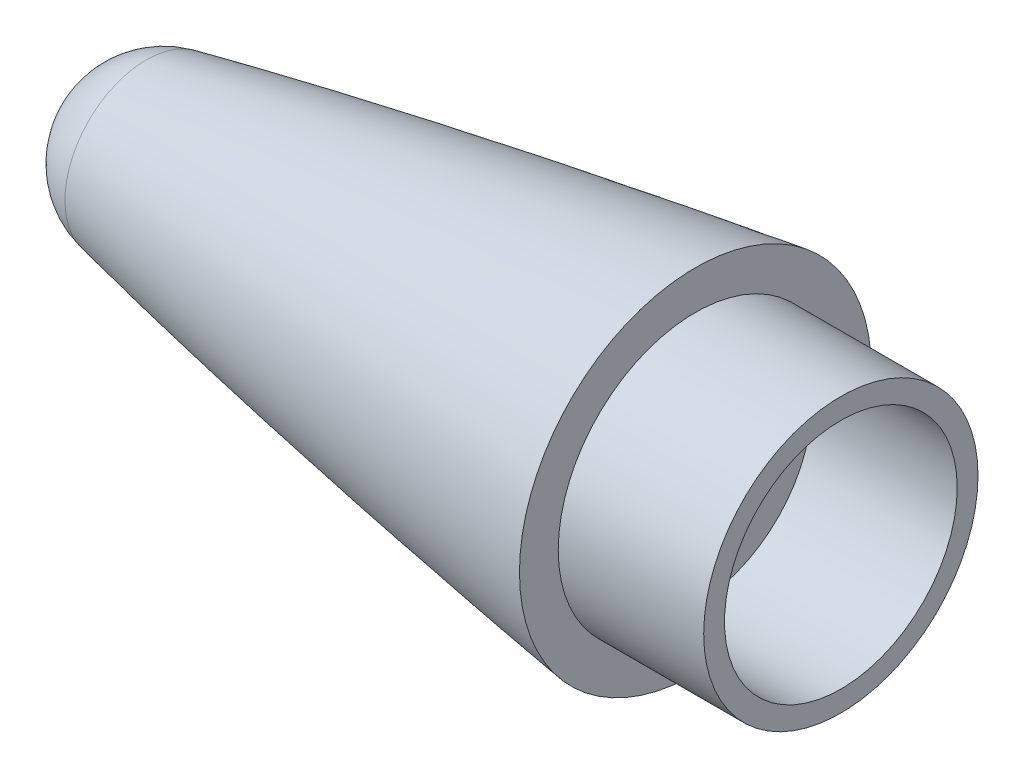
ISO-10303-21;
HEADER;
FILE_DESCRIPTION(('STEP AP214'),'2;1');
FILE_NAME('part.step','',(''),(''),'','','');
FILE_SCHEMA(('AUTOMOTIVE_DESIGN { 1 0 10303 214 1 1 1 1 }'));
ENDSEC;
DATA;
#1=APPLICATION_CONTEXT('core data for automotive mechanical design processes');
#2=APPLICATION_PROTOCOL_DEFINITION('international standard','automotive_design',2000,#1);
#3=PRODUCT_CONTEXT('',#1,'mechanical');
#4=PRODUCT('Part','Part','',(#3));
#5=PRODUCT_RELATED_PRODUCT_CATEGORY('part','',(#4));
#6=PRODUCT_DEFINITION_FORMATION('','',#4);
#7=PRODUCT_DEFINITION_CONTEXT('part definition',#1,'design');
#8=PRODUCT_DEFINITION('design','',#6,#7);
#9=PRODUCT_DEFINITION_SHAPE('','',#8);
#10=(LENGTH_UNIT() NAMED_UNIT(*) SI_UNIT(.MILLI.,.METRE.));
#11=(NAMED_UNIT(*) PLANE_ANGLE_UNIT() SI_UNIT($,.RADIAN.));
#12=(NAMED_UNIT(*) SI_UNIT($,.STERADIAN.) SOLID_ANGLE_UNIT());
#13=UNCERTAINTY_MEASURE_WITH_UNIT(LENGTH_MEASURE(1.E-05),#10,'distance_accuracy_value','');
#14=(GEOMETRIC_REPRESENTATION_CONTEXT(3) GLOBAL_UNCERTAINTY_ASSIGNED_CONTEXT((#13)) GLOBAL_UNIT_ASSIGNED_CONTEXT((#10,
#11,#12)) REPRESENTATION_CONTEXT('',''));
#15=CARTESIAN_POINT('',(0.,0.,0.));
#16=DIRECTION('',(0.,0.,1.));
#17=DIRECTION('',(1.,0.,0.));
#18=AXIS2_PLACEMENT_3D('',#15,#16,#17);
#19=CARTESIAN_POINT('',(0.,0.,0.));
#20=CARTESIAN_POINT('',(0.0016487257899739,0.00637767165344409,0.));
#21=CARTESIAN_POINT('',(0.0057621718653015,0.0188021593914274,0.));
#22=CARTESIAN_POINT('',(0.0175123313243743,0.0422493817570645,0.));
#23=CARTESIAN_POINT('',(0.046253840596632,0.0861642592508907,0.));
#24=CARTESIAN_POINT('',(0.0914748777391001,0.142292386652359,0.));
#25=CARTESIAN_POINT('',(0.154274348482774,0.20912514537751,0.));
#26=CARTESIAN_POINT('',(0.276301441633623,0.324701770965458,0.));
#27=CARTESIAN_POINT('',(0.421122579930573,0.443291574190418,0.));
#28=CARTESIAN_POINT('',(0.586286455480629,0.566464418607899,0.));
#29=CARTESIAN_POINT('',(0.83951343193514,0.741034702086761,0.));
#30=CARTESIAN_POINT('',(1.18296840036321,0.960203667032714,0.));
#31=CARTESIAN_POINT('',(1.78280966033623,1.30866238394851,0.));
#32=CARTESIAN_POINT('',(2.86829695281267,1.87162382715185,0.));
#33=CARTESIAN_POINT('',(4.76277782522134,2.73974077748204,0.));
#34=CARTESIAN_POINT('',(8.19028565992219,4.11595910205271,0.));
#35=CARTESIAN_POINT('',(14.422968110472,6.28797056713511,0.));
#36=CARTESIAN_POINT('',(24.8043027546662,9.40768115367406,0.));
#37=CARTESIAN_POINT('',(38.8994962833824,13.087626071966,0.));
#38=CARTESIAN_POINT('',(55.9277376029872,17.0568128067629,0.));
#39=CARTESIAN_POINT('',(79.0908104498615,21.9783504080432,0.));
#40=CARTESIAN_POINT('',(106.881185800737,27.3295948783205,0.));
#41=CARTESIAN_POINT('',(139.404169497215,33.0214355719504,0.));
#42=CARTESIAN_POINT('',(176.668348452349,38.9538903494959,0.));
#43=CARTESIAN_POINT('',(214.003857084132,44.4168991341357,0.));
#44=CARTESIAN_POINT('',(251.396751983993,49.471116429039,0.));
#45=CARTESIAN_POINT('',(288.837779512109,54.1545255374062,0.));
#46=CARTESIAN_POINT('',(326.320734140861,58.4892815739677,0.));
#47=CARTESIAN_POINT('',(363.841177132752,62.4863121261995,0.));
#48=CARTESIAN_POINT('',(401.39599420768,66.1465092198773,0.));
#49=CARTESIAN_POINT('',(438.982971251084,69.4606087355129,0.));
#50=CARTESIAN_POINT('',(476.600652970697,72.4071093826599,0.));
#51=CARTESIAN_POINT('',(509.542265690245,74.6286978107565,0.));
#52=CARTESIAN_POINT('',(537.796481138977,76.2335046528282,0.));
#53=CARTESIAN_POINT('',(560.292262180115,77.2754594007759,0.));
#54=CARTESIAN_POINT('',(575.19535670378,77.8326432804356,0.));
#55=CARTESIAN_POINT('',(587.214225045065,78.1730067265653,0.));
#56=CARTESIAN_POINT('',(594.51997618939,78.3103558818441,0.));
#57=CARTESIAN_POINT('',(598.173256760109,78.3543246601118,0.));
#58=CARTESIAN_POINT('',(600.,78.36,0.));
#59=B_SPLINE_CURVE_WITH_KNOTS('',4,(#19,#20,#21,#22,#23,#24,#25,#26,#27,#28,#29,#30,#31,#32,#33,
#34,#35,#36,#37,#38,#39,#40,#41,#42,#43,#44,#45,#46,#47,#48,#49,#50,#51,#52,#53,#54,#55,#56,#57,
#58),.UNSPECIFIED.,.F.,.F.,(5,1,1,1,1,1,1,1,1,1,1,1,1,1,1,1,1,1,1,1,1,1,1,1,1,1,1,1,1,1,1,1,1,1,
1,1,5),(0.,4.31412316187256E-05,8.62824632374512E-05,0.000172564926474902,0.000345129852949805,
0.000517694779424707,0.000690259705899609,0.00127990506767294,0.00157768305463857,
0.0018754610416042,0.00271726976481212,0.00396472959905857,0.00614862348380284,
0.00993227852523749,0.0164479418553174,0.028301298247299,0.0496396283350756,0.0813631631901833,
0.112451510280435,0.143539857370687,0.20571657333025,0.267893284077703,0.330069994858809,
0.392246705900878,0.454423416608389,0.516600127206857,0.578776840412764,0.640953551735382,
0.703130263297214,0.765306975424274,0.827483686980578,0.889660398581477,0.920748754835595,
0.951837111089712,0.975918555544856,0.987959277772428,1.),.UNSPECIFIED.);
#60=CARTESIAN_POINT('',(806.72,0.,0.));
#61=DIRECTION('',(1.,0.,0.));
#62=AXIS1_PLACEMENT('',#60,#61);
#63=SURFACE_OF_REVOLUTION('',#59,#62);
#64=CARTESIAN_POINT('',(200.000000000004,0.,0.));
#65=DIRECTION('',(1.,0.,0.));
#66=DIRECTION('',(0.,0.,-1.));
#67=AXIS2_PLACEMENT_3D('',#64,#65,#66);
#68=CIRCLE('',#67,42.3282803701014);
#69=CARTESIAN_POINT('',(200.000000000004,0.,-42.3282803701014));
#70=VERTEX_POINT('',#69);
#71=EDGE_CURVE('E49',#70,#70,#68,.T.);
#72=ORIENTED_EDGE('',*,*,#71,.F.);
#73=EDGE_LOOP('',(#72));
#74=FACE_BOUND('',#73,.T.);
#75=CARTESIAN_POINT('',(67.8859589123977,0.,0.));
#76=DIRECTION('',(1.,0.,0.));
#77=DIRECTION('',(0.,0.,-1.));
#78=AXIS2_PLACEMENT_3D('',#75,#76,#77);
#79=CIRCLE('',#78,19.5695013934717);
#80=CARTESIAN_POINT('',(67.8859589123977,0.,-19.5695013934717));
#81=VERTEX_POINT('',#80);
#82=EDGE_CURVE('E45',#81,#81,#79,.T.);
#83=ORIENTED_EDGE('',*,*,#82,.T.);
#84=EDGE_LOOP('',(#83));
#85=FACE_BOUND('',#84,.T.);
#86=ADVANCED_FACE('F38',(#74,#85),#63,.T.);
#87=CARTESIAN_POINT('',(72.0132601142616,0.,0.));
#88=DIRECTION('',(1.,0.,0.));
#89=DIRECTION('',(0.,1.,0.));
#90=AXIS2_PLACEMENT_3D('',#87,#88,#89);
#91=SPHERICAL_SURFACE('',#90,20.);
#92=ORIENTED_EDGE('',*,*,#82,.F.);
#93=EDGE_LOOP('',(#92));
#94=FACE_BOUND('',#93,.T.);
#95=ADVANCED_FACE('F89',(#94),#91,.T.);
#96=CARTESIAN_POINT('',(200.000000000003,-1.70487664440081E-11,0.));
#97=DIRECTION('',(1.,0.,0.));
#98=DIRECTION('',(0.,0.,-1.));
#99=AXIS2_PLACEMENT_3D('',#96,#97,#98);
#100=PLANE('',#99);
#101=CARTESIAN_POINT('',(200.000000000003,0.,0.));
#102=DIRECTION('',(1.,0.,0.));
#103=DIRECTION('',(0.,0.,-1.));
#104=AXIS2_PLACEMENT_3D('',#101,#102,#103);
#105=CIRCLE('',#104,33.);
#106=CARTESIAN_POINT('',(200.000000000003,0.,-33.));
#107=VERTEX_POINT('',#106);
#108=EDGE_CURVE('E59',#107,#107,#105,.T.);
#109=ORIENTED_EDGE('',*,*,#108,.F.);
#110=EDGE_LOOP('',(#109));
#111=FACE_BOUND('',#110,.T.);
#112=ORIENTED_EDGE('',*,*,#71,.T.);
#113=EDGE_LOOP('',(#112));
#114=FACE_BOUND('',#113,.T.);
#115=ADVANCED_FACE('F86',(#111,#114),#100,.T.);
#116=CARTESIAN_POINT('',(235.000000000003,0.,0.));
#117=DIRECTION('',(-1.,0.,0.));
#118=DIRECTION('',(0.,0.,1.));
#119=AXIS2_PLACEMENT_3D('',#116,#117,#118);
#120=CYLINDRICAL_SURFACE('',#119,28.);
#121=CARTESIAN_POINT('',(235.000000000003,0.,0.));
#122=DIRECTION('',(1.,0.,0.));
#123=DIRECTION('',(0.,0.,-1.));
#124=AXIS2_PLACEMENT_3D('',#121,#122,#123);
#125=CIRCLE('',#124,28.);
#126=CARTESIAN_POINT('',(235.000000000003,0.,-28.));
#127=VERTEX_POINT('',#126);
#128=EDGE_CURVE('E65',#127,#127,#125,.T.);
#129=ORIENTED_EDGE('',*,*,#128,.T.);
#130=EDGE_LOOP('',(#129));
#131=FACE_BOUND('',#130,.T.);
#132=CARTESIAN_POINT('',(200.000000000003,0.,0.));
#133=DIRECTION('',(1.,0.,0.));
#134=DIRECTION('',(0.,0.,-1.));
#135=AXIS2_PLACEMENT_3D('',#132,#133,#134);
#136=CIRCLE('',#135,28.);
#137=CARTESIAN_POINT('',(200.000000000003,0.,-28.));
#138=VERTEX_POINT('',#137);
#139=EDGE_CURVE('E10',#138,#138,#136,.F.);
#140=ORIENTED_EDGE('',*,*,#139,.T.);
#141=EDGE_LOOP('',(#140));
#142=FACE_BOUND('',#141,.T.);
#143=ADVANCED_FACE('F71',(#131,#142),#120,.F.);
#144=CARTESIAN_POINT('',(235.000000000003,0.,0.));
#145=DIRECTION('',(-1.,0.,0.));
#146=DIRECTION('',(0.,0.,1.));
#147=AXIS2_PLACEMENT_3D('',#144,#145,#146);
#148=CYLINDRICAL_SURFACE('',#147,33.);
#149=CARTESIAN_POINT('',(235.000000000003,0.,0.));
#150=DIRECTION('',(1.,0.,0.));
#151=DIRECTION('',(0.,0.,-1.));
#152=AXIS2_PLACEMENT_3D('',#149,#150,#151);
#153=CIRCLE('',#152,33.);
#154=CARTESIAN_POINT('',(235.000000000003,0.,-33.));
#155=VERTEX_POINT('',#154);
#156=EDGE_CURVE('E53',#155,#155,#153,.T.);
#157=ORIENTED_EDGE('',*,*,#156,.F.);
#158=EDGE_LOOP('',(#157));
#159=FACE_BOUND('',#158,.T.);
#160=ORIENTED_EDGE('',*,*,#108,.T.);
#161=EDGE_LOOP('',(#160));
#162=FACE_BOUND('',#161,.T.);
#163=ADVANCED_FACE('F77',(#159,#162),#148,.T.);
#164=CARTESIAN_POINT('',(235.000000000003,0.,0.));
#165=DIRECTION('',(1.,0.,0.));
#166=DIRECTION('',(0.,0.,-1.));
#167=AXIS2_PLACEMENT_3D('',#164,#165,#166);
#168=PLANE('',#167);
#169=ORIENTED_EDGE('',*,*,#128,.F.);
#170=EDGE_LOOP('',(#169));
#171=FACE_BOUND('',#170,.T.);
#172=ORIENTED_EDGE('',*,*,#156,.T.);
#173=EDGE_LOOP('',(#172));
#174=FACE_BOUND('',#173,.T.);
#175=ADVANCED_FACE('F73',(#171,#174),#168,.T.);
#176=ORIENTED_EDGE('',*,*,#139,.F.);
#177=EDGE_LOOP('',(#176));
#178=FACE_BOUND('',#177,.T.);
#179=ADVANCED_FACE('F76',(#178),#100,.T.);
#180=CLOSED_SHELL('',(#86,#95,#115,#143,#163,#175,#179));
#181=MANIFOLD_SOLID_BREP('B2',#180);
#182=ADVANCED_BREP_SHAPE_REPRESENTATION('',(#18,#181),#14);
#183=SHAPE_DEFINITION_REPRESENTATION(#9,#182);
ENDSEC;
END-ISO-10303-21;
